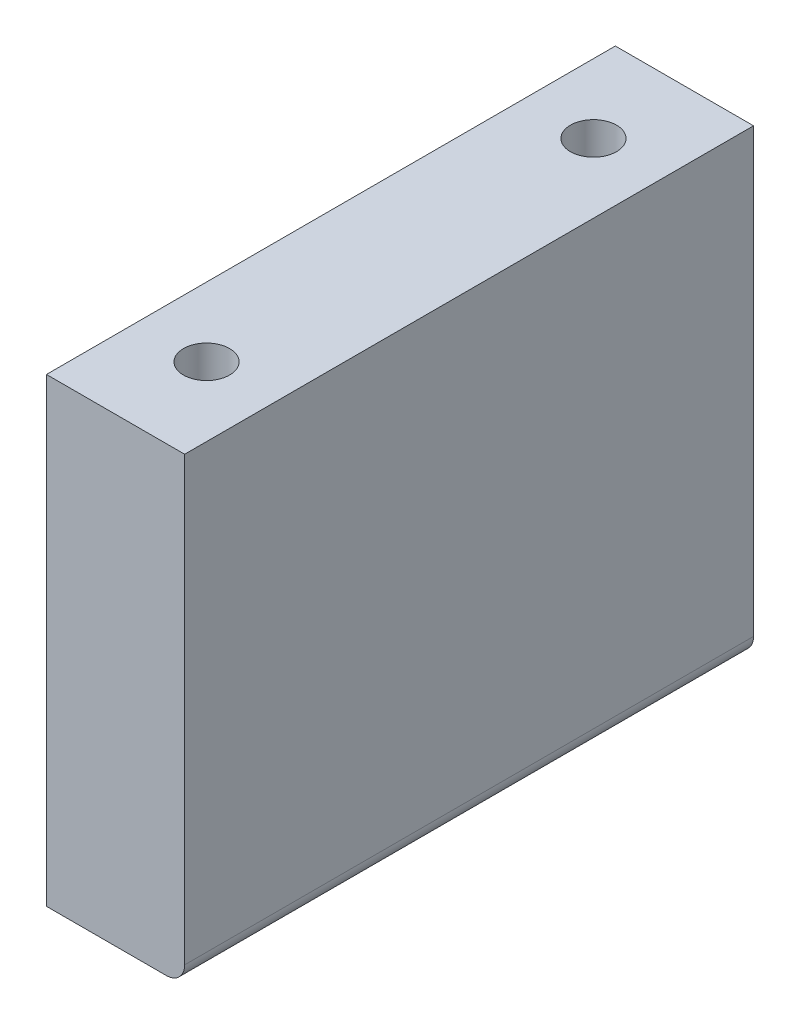
ISO-10303-21;
HEADER;
FILE_DESCRIPTION(('STEP AP214'),'2;1');
FILE_NAME('part.step','',(''),(''),'','','');
FILE_SCHEMA(('AUTOMOTIVE_DESIGN { 1 0 10303 214 1 1 1 1 }'));
ENDSEC;
DATA;
#1=APPLICATION_CONTEXT('core data for automotive mechanical design processes');
#2=APPLICATION_PROTOCOL_DEFINITION('international standard','automotive_design',2000,#1);
#3=PRODUCT_CONTEXT('',#1,'mechanical');
#4=PRODUCT('Part','Part','',(#3));
#5=PRODUCT_RELATED_PRODUCT_CATEGORY('part','',(#4));
#6=PRODUCT_DEFINITION_FORMATION('','',#4);
#7=PRODUCT_DEFINITION_CONTEXT('part definition',#1,'design');
#8=PRODUCT_DEFINITION('design','',#6,#7);
#9=PRODUCT_DEFINITION_SHAPE('','',#8);
#10=(LENGTH_UNIT() NAMED_UNIT(*) SI_UNIT(.MILLI.,.METRE.));
#11=(NAMED_UNIT(*) PLANE_ANGLE_UNIT() SI_UNIT($,.RADIAN.));
#12=(NAMED_UNIT(*) SI_UNIT($,.STERADIAN.) SOLID_ANGLE_UNIT());
#13=UNCERTAINTY_MEASURE_WITH_UNIT(LENGTH_MEASURE(1.E-05),#10,'distance_accuracy_value','');
#14=(GEOMETRIC_REPRESENTATION_CONTEXT(3) GLOBAL_UNCERTAINTY_ASSIGNED_CONTEXT((#13)) GLOBAL_UNIT_ASSIGNED_CONTEXT((#10,
#11,#12)) REPRESENTATION_CONTEXT('',''));
#15=CARTESIAN_POINT('',(0.,0.,0.));
#16=DIRECTION('',(0.,0.,1.));
#17=DIRECTION('',(1.,0.,0.));
#18=AXIS2_PLACEMENT_3D('',#15,#16,#17);
#19=CARTESIAN_POINT('',(-7.5,-50.,30.875));
#20=DIRECTION('',(1.,0.,0.));
#21=DIRECTION('',(0.,0.,-1.));
#22=AXIS2_PLACEMENT_3D('',#19,#20,#21);
#23=PLANE('',#22);
#24=DIRECTION('',(0.,-1.,0.));
#25=VECTOR('',#24,1.);
#26=CARTESIAN_POINT('',(-7.5,-50.,-30.875));
#27=LINE('',#26,#25);
#28=CARTESIAN_POINT('',(-7.5,0.,-30.875));
#29=VERTEX_POINT('',#28);
#30=CARTESIAN_POINT('',(-7.5,-50.,-30.875));
#31=VERTEX_POINT('',#30);
#32=EDGE_CURVE('E121',#29,#31,#27,.T.);
#33=ORIENTED_EDGE('',*,*,#32,.T.);
#34=DIRECTION('',(0.,0.,-1.));
#35=VECTOR('',#34,1.);
#36=CARTESIAN_POINT('',(-7.5,-50.,30.875));
#37=LINE('',#36,#35);
#38=CARTESIAN_POINT('',(-7.5,-50.,30.875));
#39=VERTEX_POINT('',#38);
#40=EDGE_CURVE('E145',#39,#31,#37,.T.);
#41=ORIENTED_EDGE('',*,*,#40,.F.);
#42=DIRECTION('',(0.,-1.,0.));
#43=VECTOR('',#42,1.);
#44=CARTESIAN_POINT('',(-7.5,-50.,30.875));
#45=LINE('',#44,#43);
#46=CARTESIAN_POINT('',(-7.5,0.,30.875));
#47=VERTEX_POINT('',#46);
#48=EDGE_CURVE('E122',#47,#39,#45,.T.);
#49=ORIENTED_EDGE('',*,*,#48,.F.);
#50=DIRECTION('',(0.,0.,-1.));
#51=VECTOR('',#50,1.);
#52=CARTESIAN_POINT('',(-7.5,0.,30.875));
#53=LINE('',#52,#51);
#54=EDGE_CURVE('E132',#47,#29,#53,.T.);
#55=ORIENTED_EDGE('',*,*,#54,.T.);
#56=EDGE_LOOP('',(#33,#41,#49,#55));
#57=FACE_BOUND('',#56,.T.);
#58=ADVANCED_FACE('F51',(#57),#23,.F.);
#59=CARTESIAN_POINT('',(-7.5,-50.,30.875));
#60=DIRECTION('',(0.,1.,0.));
#61=DIRECTION('',(0.,0.,1.));
#62=AXIS2_PLACEMENT_3D('',#59,#60,#61);
#63=PLANE('',#62);
#64=DIRECTION('',(1.,0.,0.));
#65=VECTOR('',#64,1.);
#66=CARTESIAN_POINT('',(-7.5,-50.,-30.875));
#67=LINE('',#66,#65);
#68=CARTESIAN_POINT('',(5.50000000000002,-50.,-30.875));
#69=VERTEX_POINT('',#68);
#70=EDGE_CURVE('E135',#31,#69,#67,.T.);
#71=ORIENTED_EDGE('',*,*,#70,.T.);
#72=DIRECTION('',(0.,0.,-1.));
#73=VECTOR('',#72,1.);
#74=CARTESIAN_POINT('',(5.50000000000002,-50.,30.875));
#75=LINE('',#74,#73);
#76=CARTESIAN_POINT('',(5.50000000000002,-50.,30.875));
#77=VERTEX_POINT('',#76);
#78=EDGE_CURVE('E59',#69,#77,#75,.F.);
#79=ORIENTED_EDGE('',*,*,#78,.T.);
#80=DIRECTION('',(1.,0.,0.));
#81=VECTOR('',#80,1.);
#82=CARTESIAN_POINT('',(-7.5,-50.,30.875));
#83=LINE('',#82,#81);
#84=EDGE_CURVE('E125',#39,#77,#83,.T.);
#85=ORIENTED_EDGE('',*,*,#84,.F.);
#86=ORIENTED_EDGE('',*,*,#40,.T.);
#87=EDGE_LOOP('',(#71,#79,#85,#86));
#88=FACE_BOUND('',#87,.T.);
#89=ADVANCED_FACE('F181',(#88),#63,.F.);
#90=CARTESIAN_POINT('',(7.50000000000002,-50.,30.875));
#91=DIRECTION('',(-1.,0.,0.));
#92=DIRECTION('',(0.,-1.,0.));
#93=AXIS2_PLACEMENT_3D('',#90,#91,#92);
#94=PLANE('',#93);
#95=DIRECTION('',(0.,1.,0.));
#96=VECTOR('',#95,1.);
#97=CARTESIAN_POINT('',(7.50000000000002,-50.,30.875));
#98=LINE('',#97,#96);
#99=CARTESIAN_POINT('',(7.50000000000002,-48.,30.875));
#100=VERTEX_POINT('',#99);
#101=CARTESIAN_POINT('',(7.5,0.,30.875));
#102=VERTEX_POINT('',#101);
#103=EDGE_CURVE('E128',#100,#102,#98,.T.);
#104=ORIENTED_EDGE('',*,*,#103,.F.);
#105=DIRECTION('',(0.,0.,-1.));
#106=VECTOR('',#105,1.);
#107=CARTESIAN_POINT('',(7.50000000000002,-48.,30.875));
#108=LINE('',#107,#106);
#109=CARTESIAN_POINT('',(7.50000000000002,-48.,-30.875));
#110=VERTEX_POINT('',#109);
#111=EDGE_CURVE('E148',#100,#110,#108,.T.);
#112=ORIENTED_EDGE('',*,*,#111,.T.);
#113=DIRECTION('',(0.,1.,0.));
#114=VECTOR('',#113,1.);
#115=CARTESIAN_POINT('',(7.50000000000002,-50.,-30.875));
#116=LINE('',#115,#114);
#117=CARTESIAN_POINT('',(7.5,0.,-30.875));
#118=VERTEX_POINT('',#117);
#119=EDGE_CURVE('E137',#110,#118,#116,.T.);
#120=ORIENTED_EDGE('',*,*,#119,.T.);
#121=DIRECTION('',(0.,0.,-1.));
#122=VECTOR('',#121,1.);
#123=CARTESIAN_POINT('',(7.5,0.,30.875));
#124=LINE('',#123,#122);
#125=EDGE_CURVE('E142',#102,#118,#124,.T.);
#126=ORIENTED_EDGE('',*,*,#125,.F.);
#127=EDGE_LOOP('',(#104,#112,#120,#126));
#128=FACE_BOUND('',#127,.T.);
#129=ADVANCED_FACE('F154',(#128),#94,.F.);
#130=CARTESIAN_POINT('',(-7.5,0.,30.875));
#131=DIRECTION('',(0.,-1.,0.));
#132=DIRECTION('',(1.,0.,0.));
#133=AXIS2_PLACEMENT_3D('',#130,#131,#132);
#134=PLANE('',#133);
#135=CARTESIAN_POINT('',(0.,0.,-21.));
#136=DIRECTION('',(0.,1.,0.));
#137=DIRECTION('',(0.,0.,1.));
#138=AXIS2_PLACEMENT_3D('',#135,#136,#137);
#139=CIRCLE('',#138,2.49999999999999);
#140=CARTESIAN_POINT('',(0.,0.,-18.5));
#141=VERTEX_POINT('',#140);
#142=EDGE_CURVE('E111',#141,#141,#139,.T.);
#143=ORIENTED_EDGE('',*,*,#142,.F.);
#144=EDGE_LOOP('',(#143));
#145=FACE_BOUND('',#144,.T.);
#146=CARTESIAN_POINT('',(0.,0.,21.));
#147=DIRECTION('',(0.,1.,0.));
#148=DIRECTION('',(0.,0.,1.));
#149=AXIS2_PLACEMENT_3D('',#146,#147,#148);
#150=CIRCLE('',#149,2.49999999999999);
#151=CARTESIAN_POINT('',(0.,0.,23.5));
#152=VERTEX_POINT('',#151);
#153=EDGE_CURVE('E110',#152,#152,#150,.T.);
#154=ORIENTED_EDGE('',*,*,#153,.F.);
#155=EDGE_LOOP('',(#154));
#156=FACE_BOUND('',#155,.T.);
#157=DIRECTION('',(-1.,0.,0.));
#158=VECTOR('',#157,1.);
#159=CARTESIAN_POINT('',(-7.5,0.,-30.875));
#160=LINE('',#159,#158);
#161=EDGE_CURVE('E126',#118,#29,#160,.T.);
#162=ORIENTED_EDGE('',*,*,#161,.T.);
#163=ORIENTED_EDGE('',*,*,#54,.F.);
#164=DIRECTION('',(-1.,0.,0.));
#165=VECTOR('',#164,1.);
#166=CARTESIAN_POINT('',(-7.5,0.,30.875));
#167=LINE('',#166,#165);
#168=EDGE_CURVE('E130',#102,#47,#167,.T.);
#169=ORIENTED_EDGE('',*,*,#168,.F.);
#170=ORIENTED_EDGE('',*,*,#125,.T.);
#171=EDGE_LOOP('',(#162,#163,#169,#170));
#172=FACE_BOUND('',#171,.T.);
#173=ADVANCED_FACE('F163',(#145,#156,#172),#134,.F.);
#174=CARTESIAN_POINT('',(0.,0.,30.875));
#175=DIRECTION('',(0.,0.,-1.));
#176=DIRECTION('',(-1.,0.,0.));
#177=AXIS2_PLACEMENT_3D('',#174,#175,#176);
#178=PLANE('',#177);
#179=ORIENTED_EDGE('',*,*,#84,.T.);
#180=CARTESIAN_POINT('',(5.50000000000002,-48.,30.875));
#181=DIRECTION('',(0.,0.,-1.));
#182=DIRECTION('',(-1.,0.,0.));
#183=AXIS2_PLACEMENT_3D('',#180,#181,#182);
#184=CIRCLE('',#183,2.);
#185=EDGE_CURVE('E11',#77,#100,#184,.F.);
#186=ORIENTED_EDGE('',*,*,#185,.T.);
#187=ORIENTED_EDGE('',*,*,#103,.T.);
#188=ORIENTED_EDGE('',*,*,#168,.T.);
#189=ORIENTED_EDGE('',*,*,#48,.T.);
#190=EDGE_LOOP('',(#179,#186,#187,#188,#189));
#191=FACE_BOUND('',#190,.T.);
#192=ADVANCED_FACE('F169',(#191),#178,.F.);
#193=CARTESIAN_POINT('',(0.,0.,-30.875));
#194=DIRECTION('',(0.,0.,-1.));
#195=DIRECTION('',(-1.,0.,0.));
#196=AXIS2_PLACEMENT_3D('',#193,#194,#195);
#197=PLANE('',#196);
#198=ORIENTED_EDGE('',*,*,#119,.F.);
#199=CARTESIAN_POINT('',(5.50000000000002,-48.,-30.875));
#200=DIRECTION('',(0.,0.,-1.));
#201=DIRECTION('',(-1.,0.,0.));
#202=AXIS2_PLACEMENT_3D('',#199,#200,#201);
#203=CIRCLE('',#202,2.);
#204=EDGE_CURVE('E73',#110,#69,#203,.T.);
#205=ORIENTED_EDGE('',*,*,#204,.T.);
#206=ORIENTED_EDGE('',*,*,#70,.F.);
#207=ORIENTED_EDGE('',*,*,#32,.F.);
#208=ORIENTED_EDGE('',*,*,#161,.F.);
#209=EDGE_LOOP('',(#198,#205,#206,#207,#208));
#210=FACE_BOUND('',#209,.T.);
#211=ADVANCED_FACE('F159',(#210),#197,.T.);
#212=CARTESIAN_POINT('',(5.50000000000002,-48.,30.875));
#213=DIRECTION('',(0.,0.,-1.));
#214=DIRECTION('',(-1.,0.,0.));
#215=AXIS2_PLACEMENT_3D('',#212,#213,#214);
#216=CYLINDRICAL_SURFACE('',#215,2.);
#217=ORIENTED_EDGE('',*,*,#185,.F.);
#218=ORIENTED_EDGE('',*,*,#78,.F.);
#219=ORIENTED_EDGE('',*,*,#204,.F.);
#220=ORIENTED_EDGE('',*,*,#111,.F.);
#221=EDGE_LOOP('',(#217,#218,#219,#220));
#222=FACE_BOUND('',#221,.T.);
#223=ADVANCED_FACE('F53',(#222),#216,.T.);
#224=CARTESIAN_POINT('',(0.,-17.,21.));
#225=DIRECTION('',(0.,1.,0.));
#226=DIRECTION('',(0.,0.,1.));
#227=AXIS2_PLACEMENT_3D('',#224,#225,#226);
#228=CONICAL_SURFACE('',#227,2.49999999999999,1.02974425867665);
#229=CARTESIAN_POINT('',(0.,-18.5021515475689,21.));
#230=VERTEX_POINT('',#229);
#231=VERTEX_LOOP('',#230);
#232=FACE_BOUND('',#231,.T.);
#233=CARTESIAN_POINT('',(0.,-17.,21.));
#234=DIRECTION('',(0.,1.,0.));
#235=DIRECTION('',(0.,0.,1.));
#236=AXIS2_PLACEMENT_3D('',#233,#234,#235);
#237=CIRCLE('',#236,2.49999999999999);
#238=CARTESIAN_POINT('',(0.,-17.,23.5));
#239=VERTEX_POINT('',#238);
#240=EDGE_CURVE('E114',#239,#239,#237,.T.);
#241=ORIENTED_EDGE('',*,*,#240,.T.);
#242=EDGE_LOOP('',(#241));
#243=FACE_BOUND('',#242,.T.);
#244=ADVANCED_FACE('F171',(#232,#243),#228,.F.);
#245=CARTESIAN_POINT('',(0.,0.,21.));
#246=DIRECTION('',(0.,1.,0.));
#247=DIRECTION('',(0.,0.,1.));
#248=AXIS2_PLACEMENT_3D('',#245,#246,#247);
#249=CYLINDRICAL_SURFACE('',#248,2.49999999999999);
#250=ORIENTED_EDGE('',*,*,#240,.F.);
#251=EDGE_LOOP('',(#250));
#252=FACE_BOUND('',#251,.T.);
#253=ORIENTED_EDGE('',*,*,#153,.T.);
#254=EDGE_LOOP('',(#253));
#255=FACE_BOUND('',#254,.T.);
#256=ADVANCED_FACE('F104',(#252,#255),#249,.F.);
#257=CARTESIAN_POINT('',(0.,-17.,-21.));
#258=DIRECTION('',(0.,1.,0.));
#259=DIRECTION('',(0.,0.,1.));
#260=AXIS2_PLACEMENT_3D('',#257,#258,#259);
#261=CONICAL_SURFACE('',#260,2.49999999999999,1.02974425867665);
#262=CARTESIAN_POINT('',(0.,-18.5021515475689,-21.));
#263=VERTEX_POINT('',#262);
#264=VERTEX_LOOP('',#263);
#265=FACE_BOUND('',#264,.T.);
#266=CARTESIAN_POINT('',(0.,-17.,-21.));
#267=DIRECTION('',(0.,1.,0.));
#268=DIRECTION('',(0.,0.,1.));
#269=AXIS2_PLACEMENT_3D('',#266,#267,#268);
#270=CIRCLE('',#269,2.49999999999999);
#271=CARTESIAN_POINT('',(0.,-17.,-18.5));
#272=VERTEX_POINT('',#271);
#273=EDGE_CURVE('E108',#272,#272,#270,.T.);
#274=ORIENTED_EDGE('',*,*,#273,.T.);
#275=EDGE_LOOP('',(#274));
#276=FACE_BOUND('',#275,.T.);
#277=ADVANCED_FACE('F100',(#265,#276),#261,.F.);
#278=CARTESIAN_POINT('',(0.,0.,-21.));
#279=DIRECTION('',(0.,1.,0.));
#280=DIRECTION('',(0.,0.,1.));
#281=AXIS2_PLACEMENT_3D('',#278,#279,#280);
#282=CYLINDRICAL_SURFACE('',#281,2.49999999999999);
#283=ORIENTED_EDGE('',*,*,#273,.F.);
#284=EDGE_LOOP('',(#283));
#285=FACE_BOUND('',#284,.T.);
#286=ORIENTED_EDGE('',*,*,#142,.T.);
#287=EDGE_LOOP('',(#286));
#288=FACE_BOUND('',#287,.T.);
#289=ADVANCED_FACE('F103',(#285,#288),#282,.F.);
#290=CLOSED_SHELL('',(#58,#89,#129,#173,#192,#211,#223,#244,#256,#277,#289));
#291=MANIFOLD_SOLID_BREP('B2',#290);
#292=ADVANCED_BREP_SHAPE_REPRESENTATION('',(#18,#291),#14);
#293=SHAPE_DEFINITION_REPRESENTATION(#9,#292);
ENDSEC;
END-ISO-10303-21;
